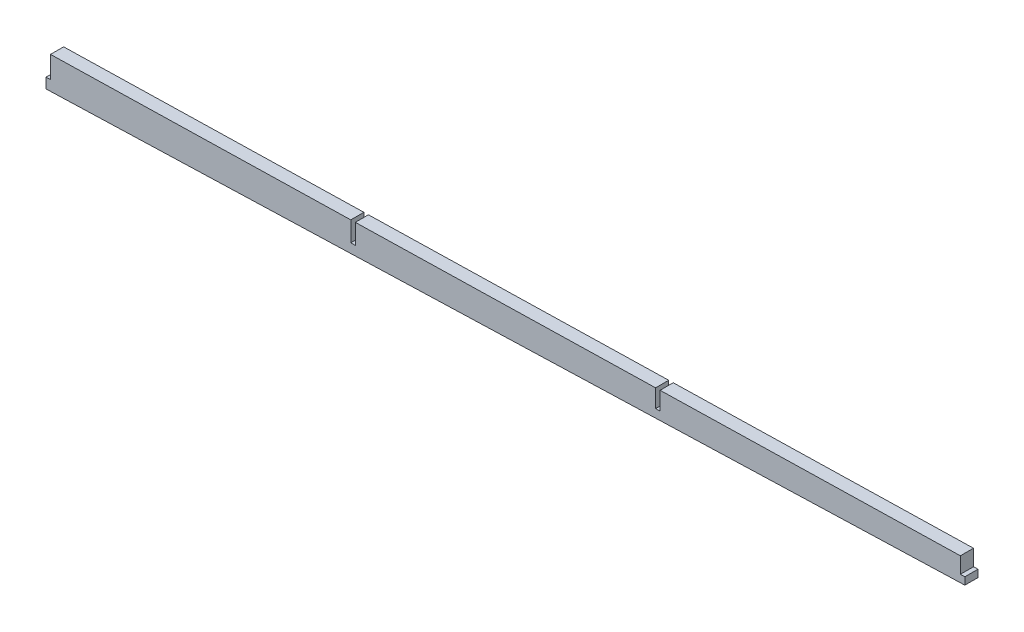
ISO-10303-21;
HEADER;
FILE_DESCRIPTION(('STEP AP214'),'2;1');
FILE_NAME('part.step','',(''),(''),'','','');
FILE_SCHEMA(('AUTOMOTIVE_DESIGN { 1 0 10303 214 1 1 1 1 }'));
ENDSEC;
DATA;
#1=APPLICATION_CONTEXT('core data for automotive mechanical design processes');
#2=APPLICATION_PROTOCOL_DEFINITION('international standard','automotive_design',2000,#1);
#3=PRODUCT_CONTEXT('',#1,'mechanical');
#4=PRODUCT('Part','Part','',(#3));
#5=PRODUCT_RELATED_PRODUCT_CATEGORY('part','',(#4));
#6=PRODUCT_DEFINITION_FORMATION('','',#4);
#7=PRODUCT_DEFINITION_CONTEXT('part definition',#1,'design');
#8=PRODUCT_DEFINITION('design','',#6,#7);
#9=PRODUCT_DEFINITION_SHAPE('','',#8);
#10=(LENGTH_UNIT() NAMED_UNIT(*) SI_UNIT(.MILLI.,.METRE.));
#11=(NAMED_UNIT(*) PLANE_ANGLE_UNIT() SI_UNIT($,.RADIAN.));
#12=(NAMED_UNIT(*) SI_UNIT($,.STERADIAN.) SOLID_ANGLE_UNIT());
#13=UNCERTAINTY_MEASURE_WITH_UNIT(LENGTH_MEASURE(1.E-05),#10,'distance_accuracy_value','');
#14=(GEOMETRIC_REPRESENTATION_CONTEXT(3) GLOBAL_UNCERTAINTY_ASSIGNED_CONTEXT((#13)) GLOBAL_UNIT_ASSIGNED_CONTEXT((#10,
#11,#12)) REPRESENTATION_CONTEXT('',''));
#15=CARTESIAN_POINT('',(0.,0.,0.));
#16=DIRECTION('',(0.,0.,1.));
#17=DIRECTION('',(1.,0.,0.));
#18=AXIS2_PLACEMENT_3D('',#15,#16,#17);
#19=CARTESIAN_POINT('',(1.21390748326506,0.,40.463582775502));
#20=DIRECTION('',(0.029986509105671,0.,0.999550303522367));
#21=DIRECTION('',(0.999550303522367,0.,-0.029986509105671));
#22=AXIS2_PLACEMENT_3D('',#19,#20,#21);
#23=PLANE('',#22);
#24=DIRECTION('',(0.999550303522367,0.,-0.0299865091056743));
#25=VECTOR('',#24,1.);
#26=CARTESIAN_POINT('',(-1000.,0.,70.5));
#27=LINE('',#26,#25);
#28=CARTESIAN_POINT('',(-1000.,0.,70.5));
#29=VERTEX_POINT('',#28);
#30=CARTESIAN_POINT('',(-997.,0.,70.41));
#31=VERTEX_POINT('',#30);
#32=EDGE_CURVE('E187',#29,#31,#27,.T.);
#33=ORIENTED_EDGE('',*,*,#32,.T.);
#34=DIRECTION('',(0.,-1.,0.));
#35=VECTOR('',#34,1.);
#36=CARTESIAN_POINT('',(-997.,30.,70.41));
#37=LINE('',#36,#35);
#38=CARTESIAN_POINT('',(-997.,14.9803921568627,70.41));
#39=VERTEX_POINT('',#38);
#40=EDGE_CURVE('E174',#39,#31,#37,.T.);
#41=ORIENTED_EDGE('',*,*,#40,.F.);
#42=DIRECTION('',(-0.999528973701543,0.00653286910916042,0.0299858692110463));
#43=VECTOR('',#42,1.);
#44=CARTESIAN_POINT('',(-388.,11.,52.14));
#45=LINE('',#44,#43);
#46=CARTESIAN_POINT('',(-797.,13.6732026143791,64.41));
#47=VERTEX_POINT('',#46);
#48=EDGE_CURVE('E348',#47,#39,#45,.T.);
#49=ORIENTED_EDGE('',*,*,#48,.F.);
#50=DIRECTION('',(0.,-1.,0.));
#51=VECTOR('',#50,1.);
#52=CARTESIAN_POINT('',(-797.,30.,64.41));
#53=LINE('',#52,#51);
#54=CARTESIAN_POINT('',(-797.,0.,64.41));
#55=VERTEX_POINT('',#54);
#56=EDGE_CURVE('E428',#47,#55,#53,.T.);
#57=ORIENTED_EDGE('',*,*,#56,.T.);
#58=DIRECTION('',(0.999550303522367,0.,-0.0299865091056743));
#59=VECTOR('',#58,1.);
#60=CARTESIAN_POINT('',(-797.,0.,64.41));
#61=LINE('',#60,#59);
#62=CARTESIAN_POINT('',(-794.,0.,64.32));
#63=VERTEX_POINT('',#62);
#64=EDGE_CURVE('E198',#55,#63,#61,.T.);
#65=ORIENTED_EDGE('',*,*,#64,.T.);
#66=DIRECTION('',(0.,-1.,0.));
#67=VECTOR('',#66,1.);
#68=CARTESIAN_POINT('',(-794.,30.,64.32));
#69=LINE('',#68,#67);
#70=CARTESIAN_POINT('',(-794.,13.6535947712418,64.32));
#71=VERTEX_POINT('',#70);
#72=EDGE_CURVE('E503',#71,#63,#69,.T.);
#73=ORIENTED_EDGE('',*,*,#72,.F.);
#74=CARTESIAN_POINT('',(-594.,12.3464052287582,58.32));
#75=VERTEX_POINT('',#74);
#76=EDGE_CURVE('E365',#75,#71,#45,.T.);
#77=ORIENTED_EDGE('',*,*,#76,.F.);
#78=DIRECTION('',(0.,-1.,0.));
#79=VECTOR('',#78,1.);
#80=CARTESIAN_POINT('',(-594.,30.,58.32));
#81=LINE('',#80,#79);
#82=CARTESIAN_POINT('',(-594.,0.,58.32));
#83=VERTEX_POINT('',#82);
#84=EDGE_CURVE('E416',#75,#83,#81,.T.);
#85=ORIENTED_EDGE('',*,*,#84,.T.);
#86=DIRECTION('',(0.999550303522367,0.,-0.0299865091056674));
#87=VECTOR('',#86,1.);
#88=CARTESIAN_POINT('',(-594.,0.,58.32));
#89=LINE('',#88,#87);
#90=CARTESIAN_POINT('',(-591.,0.,58.23));
#91=VERTEX_POINT('',#90);
#92=EDGE_CURVE('E396',#83,#91,#89,.T.);
#93=ORIENTED_EDGE('',*,*,#92,.T.);
#94=DIRECTION('',(0.,-1.,0.));
#95=VECTOR('',#94,1.);
#96=CARTESIAN_POINT('',(-591.,30.,58.23));
#97=LINE('',#96,#95);
#98=CARTESIAN_POINT('',(-591.,12.3267973856209,58.23));
#99=VERTEX_POINT('',#98);
#100=EDGE_CURVE('E393',#99,#91,#97,.T.);
#101=ORIENTED_EDGE('',*,*,#100,.F.);
#102=CARTESIAN_POINT('',(-391.,11.0196078431373,52.23));
#103=VERTEX_POINT('',#102);
#104=EDGE_CURVE('E309',#103,#99,#45,.T.);
#105=ORIENTED_EDGE('',*,*,#104,.F.);
#106=DIRECTION('',(0.,-1.,0.));
#107=VECTOR('',#106,1.);
#108=CARTESIAN_POINT('',(-391.,30.,52.23));
#109=LINE('',#108,#107);
#110=CARTESIAN_POINT('',(-391.,0.,52.23));
#111=VERTEX_POINT('',#110);
#112=EDGE_CURVE('E391',#103,#111,#109,.T.);
#113=ORIENTED_EDGE('',*,*,#112,.T.);
#114=DIRECTION('',(0.999550303522367,0.,-0.0299865091056727));
#115=VECTOR('',#114,1.);
#116=CARTESIAN_POINT('',(-391.,0.,52.23));
#117=LINE('',#116,#115);
#118=CARTESIAN_POINT('',(-388.,0.,52.14));
#119=VERTEX_POINT('',#118);
#120=EDGE_CURVE('E418',#111,#119,#117,.T.);
#121=ORIENTED_EDGE('',*,*,#120,.T.);
#122=DIRECTION('',(0.,1.,0.));
#123=VECTOR('',#122,1.);
#124=CARTESIAN_POINT('',(-388.,-5.,52.14));
#125=LINE('',#124,#123);
#126=CARTESIAN_POINT('',(-388.,-5.,52.14));
#127=VERTEX_POINT('',#126);
#128=EDGE_CURVE('E206',#127,#119,#125,.T.);
#129=ORIENTED_EDGE('',*,*,#128,.F.);
#130=DIRECTION('',(-0.999544970939143,-0.00326648683313445,0.0299863491281743));
#131=VECTOR('',#130,1.);
#132=CARTESIAN_POINT('',(-388.,-5.,52.14));
#133=LINE('',#132,#131);
#134=CARTESIAN_POINT('',(-1000.,-7.,70.5));
#135=VERTEX_POINT('',#134);
#136=EDGE_CURVE('E313',#127,#135,#133,.T.);
#137=ORIENTED_EDGE('',*,*,#136,.T.);
#138=DIRECTION('',(0.,-1.,0.));
#139=VECTOR('',#138,1.);
#140=CARTESIAN_POINT('',(-1000.,15.,70.5));
#141=LINE('',#140,#139);
#142=EDGE_CURVE('E195',#29,#135,#141,.T.);
#143=ORIENTED_EDGE('',*,*,#142,.F.);
#144=EDGE_LOOP('',(#33,#41,#49,#57,#65,#73,#77,#85,#93,#101,#105,#113,#121,#129,#137,#143));
#145=FACE_BOUND('',#144,.T.);
#146=ADVANCED_FACE('F57',(#145),#23,.F.);
#147=CARTESIAN_POINT('',(1.48366470176841,0.,49.4554900589469));
#148=DIRECTION('',(-0.029986509105671,0.,-0.999550303522367));
#149=DIRECTION('',(-0.999550303522367,0.,0.029986509105671));
#150=AXIS2_PLACEMENT_3D('',#147,#148,#149);
#151=PLANE('',#150);
#152=DIRECTION('',(-0.999528973701543,0.00653286910916042,0.0299858692110463));
#153=VECTOR('',#152,1.);
#154=CARTESIAN_POINT('',(-388.,11.,61.14));
#155=LINE('',#154,#153);
#156=CARTESIAN_POINT('',(-797.,13.6732026143791,73.41));
#157=VERTEX_POINT('',#156);
#158=CARTESIAN_POINT('',(-997.,14.9803921568627,79.41));
#159=VERTEX_POINT('',#158);
#160=EDGE_CURVE('E317',#157,#159,#155,.T.);
#161=ORIENTED_EDGE('',*,*,#160,.T.);
#162=DIRECTION('',(0.,-1.,0.));
#163=VECTOR('',#162,1.);
#164=CARTESIAN_POINT('',(-997.,30.,79.41));
#165=LINE('',#164,#163);
#166=CARTESIAN_POINT('',(-997.,0.,79.41));
#167=VERTEX_POINT('',#166);
#168=EDGE_CURVE('E77',#159,#167,#165,.T.);
#169=ORIENTED_EDGE('',*,*,#168,.T.);
#170=DIRECTION('',(-0.999550303522367,0.,0.0299865091056686));
#171=VECTOR('',#170,1.);
#172=CARTESIAN_POINT('',(-997.,0.,79.41));
#173=LINE('',#172,#171);
#174=CARTESIAN_POINT('',(-1000.,0.,79.5));
#175=VERTEX_POINT('',#174);
#176=EDGE_CURVE('E190',#167,#175,#173,.T.);
#177=ORIENTED_EDGE('',*,*,#176,.T.);
#178=DIRECTION('',(0.,1.,0.));
#179=VECTOR('',#178,1.);
#180=CARTESIAN_POINT('',(-1000.,-7.,79.5));
#181=LINE('',#180,#179);
#182=CARTESIAN_POINT('',(-1000.,-7.,79.5));
#183=VERTEX_POINT('',#182);
#184=EDGE_CURVE('E62',#183,#175,#181,.T.);
#185=ORIENTED_EDGE('',*,*,#184,.F.);
#186=DIRECTION('',(-0.999544970939143,-0.00326648683313446,0.0299863491281743));
#187=VECTOR('',#186,1.);
#188=CARTESIAN_POINT('',(-388.,-5.,61.14));
#189=LINE('',#188,#187);
#190=CARTESIAN_POINT('',(-388.,-5.,61.14));
#191=VERTEX_POINT('',#190);
#192=EDGE_CURVE('E306',#191,#183,#189,.T.);
#193=ORIENTED_EDGE('',*,*,#192,.F.);
#194=DIRECTION('',(0.,-1.,0.));
#195=VECTOR('',#194,1.);
#196=CARTESIAN_POINT('',(-388.,-5.,61.14));
#197=LINE('',#196,#195);
#198=CARTESIAN_POINT('',(-388.,0.,61.14));
#199=VERTEX_POINT('',#198);
#200=EDGE_CURVE('E319',#199,#191,#197,.T.);
#201=ORIENTED_EDGE('',*,*,#200,.F.);
#202=DIRECTION('',(-0.999550303522367,0.,0.0299865091056732));
#203=VECTOR('',#202,1.);
#204=CARTESIAN_POINT('',(-388.,0.,61.14));
#205=LINE('',#204,#203);
#206=CARTESIAN_POINT('',(-391.,0.,61.23));
#207=VERTEX_POINT('',#206);
#208=EDGE_CURVE('E252',#199,#207,#205,.T.);
#209=ORIENTED_EDGE('',*,*,#208,.T.);
#210=DIRECTION('',(0.,-1.,0.));
#211=VECTOR('',#210,1.);
#212=CARTESIAN_POINT('',(-391.,30.,61.23));
#213=LINE('',#212,#211);
#214=CARTESIAN_POINT('',(-391.,11.0196078431373,61.23));
#215=VERTEX_POINT('',#214);
#216=EDGE_CURVE('E429',#215,#207,#213,.T.);
#217=ORIENTED_EDGE('',*,*,#216,.F.);
#218=CARTESIAN_POINT('',(-591.,12.3267973856209,67.23));
#219=VERTEX_POINT('',#218);
#220=EDGE_CURVE('E344',#215,#219,#155,.T.);
#221=ORIENTED_EDGE('',*,*,#220,.T.);
#222=DIRECTION('',(0.,-1.,0.));
#223=VECTOR('',#222,1.);
#224=CARTESIAN_POINT('',(-591.,30.,67.23));
#225=LINE('',#224,#223);
#226=CARTESIAN_POINT('',(-591.,0.,67.23));
#227=VERTEX_POINT('',#226);
#228=EDGE_CURVE('E402',#219,#227,#225,.T.);
#229=ORIENTED_EDGE('',*,*,#228,.T.);
#230=DIRECTION('',(-0.999550303522367,0.,0.0299865091056651));
#231=VECTOR('',#230,1.);
#232=CARTESIAN_POINT('',(-591.,0.,67.23));
#233=LINE('',#232,#231);
#234=CARTESIAN_POINT('',(-594.,0.,67.32));
#235=VERTEX_POINT('',#234);
#236=EDGE_CURVE('E407',#227,#235,#233,.T.);
#237=ORIENTED_EDGE('',*,*,#236,.T.);
#238=DIRECTION('',(0.,-1.,0.));
#239=VECTOR('',#238,1.);
#240=CARTESIAN_POINT('',(-594.,30.,67.32));
#241=LINE('',#240,#239);
#242=CARTESIAN_POINT('',(-594.,12.3464052287582,67.32));
#243=VERTEX_POINT('',#242);
#244=EDGE_CURVE('E410',#243,#235,#241,.T.);
#245=ORIENTED_EDGE('',*,*,#244,.F.);
#246=CARTESIAN_POINT('',(-794.,13.6535947712418,73.32));
#247=VERTEX_POINT('',#246);
#248=EDGE_CURVE('E349',#243,#247,#155,.T.);
#249=ORIENTED_EDGE('',*,*,#248,.T.);
#250=DIRECTION('',(0.,-1.,0.));
#251=VECTOR('',#250,1.);
#252=CARTESIAN_POINT('',(-794.,30.,73.32));
#253=LINE('',#252,#251);
#254=CARTESIAN_POINT('',(-794.,0.,73.32));
#255=VERTEX_POINT('',#254);
#256=EDGE_CURVE('E84',#247,#255,#253,.T.);
#257=ORIENTED_EDGE('',*,*,#256,.T.);
#258=DIRECTION('',(-0.999550303522367,0.,0.0299865091056675));
#259=VECTOR('',#258,1.);
#260=CARTESIAN_POINT('',(-794.,0.,73.32));
#261=LINE('',#260,#259);
#262=CARTESIAN_POINT('',(-797.,0.,73.41));
#263=VERTEX_POINT('',#262);
#264=EDGE_CURVE('E512',#255,#263,#261,.T.);
#265=ORIENTED_EDGE('',*,*,#264,.T.);
#266=DIRECTION('',(0.,-1.,0.));
#267=VECTOR('',#266,1.);
#268=CARTESIAN_POINT('',(-797.,30.,73.41));
#269=LINE('',#268,#267);
#270=EDGE_CURVE('E359',#157,#263,#269,.T.);
#271=ORIENTED_EDGE('',*,*,#270,.F.);
#272=EDGE_LOOP('',(#161,#169,#177,#185,#193,#201,#209,#217,#221,#229,#237,#245,#249,#257,#265,#271));
#273=FACE_BOUND('',#272,.T.);
#274=ADVANCED_FACE('F273',(#273),#151,.F.);
#275=CARTESIAN_POINT('',(0.055318240068347,8.46369073045708,0.));
#276=DIRECTION('',(-0.00653580811358207,-0.999978641378056,0.));
#277=DIRECTION('',(0.999978641378056,-0.00653580811358207,0.));
#278=AXIS2_PLACEMENT_3D('',#275,#276,#277);
#279=PLANE('',#278);
#280=ORIENTED_EDGE('',*,*,#48,.T.);
#281=DIRECTION('',(0.,0.,1.));
#282=VECTOR('',#281,1.);
#283=CARTESIAN_POINT('',(-997.000000000001,14.9803921568628,1.23028991893759E-11));
#284=LINE('',#283,#282);
#285=EDGE_CURVE('E12',#39,#159,#284,.T.);
#286=ORIENTED_EDGE('',*,*,#285,.T.);
#287=ORIENTED_EDGE('',*,*,#160,.F.);
#288=DIRECTION('',(0.,0.,1.));
#289=VECTOR('',#288,1.);
#290=CARTESIAN_POINT('',(-797.,13.6732026143791,0.));
#291=LINE('',#290,#289);
#292=EDGE_CURVE('E69',#47,#157,#291,.T.);
#293=ORIENTED_EDGE('',*,*,#292,.F.);
#294=EDGE_LOOP('',(#280,#286,#287,#293));
#295=FACE_BOUND('',#294,.T.);
#296=ADVANCED_FACE('F362',(#295),#279,.F.);
#297=ORIENTED_EDGE('',*,*,#76,.T.);
#298=DIRECTION('',(0.,0.,1.));
#299=VECTOR('',#298,1.);
#300=CARTESIAN_POINT('',(-794.000000000002,13.6535947712419,1.95941018445177E-11));
#301=LINE('',#300,#299);
#302=EDGE_CURVE('E485',#71,#247,#301,.T.);
#303=ORIENTED_EDGE('',*,*,#302,.T.);
#304=ORIENTED_EDGE('',*,*,#248,.F.);
#305=DIRECTION('',(0.,0.,1.));
#306=VECTOR('',#305,1.);
#307=CARTESIAN_POINT('',(-594.,12.3464052287582,0.));
#308=LINE('',#307,#306);
#309=EDGE_CURVE('E488',#75,#243,#308,.T.);
#310=ORIENTED_EDGE('',*,*,#309,.F.);
#311=EDGE_LOOP('',(#297,#303,#304,#310));
#312=FACE_BOUND('',#311,.T.);
#313=ADVANCED_FACE('F500',(#312),#279,.F.);
#314=ORIENTED_EDGE('',*,*,#104,.T.);
#315=DIRECTION('',(0.,0.,1.));
#316=VECTOR('',#315,1.);
#317=CARTESIAN_POINT('',(-591.,12.3267973856209,0.));
#318=LINE('',#317,#316);
#319=EDGE_CURVE('E387',#99,#219,#318,.T.);
#320=ORIENTED_EDGE('',*,*,#319,.T.);
#321=ORIENTED_EDGE('',*,*,#220,.F.);
#322=DIRECTION('',(0.,0.,1.));
#323=VECTOR('',#322,1.);
#324=CARTESIAN_POINT('',(-391.,11.0196078431373,2.41421935730249E-12));
#325=LINE('',#324,#323);
#326=EDGE_CURVE('E232',#103,#215,#325,.T.);
#327=ORIENTED_EDGE('',*,*,#326,.F.);
#328=EDGE_LOOP('',(#314,#320,#321,#327));
#329=FACE_BOUND('',#328,.T.);
#330=ADVANCED_FACE('F385',(#329),#279,.F.);
#331=CARTESIAN_POINT('',(-1000.,0.,0.));
#332=DIRECTION('',(-1.,0.,0.));
#333=DIRECTION('',(0.,0.,1.));
#334=AXIS2_PLACEMENT_3D('',#331,#332,#333);
#335=PLANE('',#334);
#336=DIRECTION('',(0.,0.,-1.));
#337=VECTOR('',#336,1.);
#338=CARTESIAN_POINT('',(-1000.,0.,79.5));
#339=LINE('',#338,#337);
#340=EDGE_CURVE('E183',#175,#29,#339,.T.);
#341=ORIENTED_EDGE('',*,*,#340,.T.);
#342=ORIENTED_EDGE('',*,*,#142,.T.);
#343=DIRECTION('',(0.,0.,1.));
#344=VECTOR('',#343,1.);
#345=CARTESIAN_POINT('',(-1000.,-7.,70.5));
#346=LINE('',#345,#344);
#347=EDGE_CURVE('E218',#135,#183,#346,.T.);
#348=ORIENTED_EDGE('',*,*,#347,.T.);
#349=ORIENTED_EDGE('',*,*,#184,.T.);
#350=EDGE_LOOP('',(#341,#342,#348,#349));
#351=FACE_BOUND('',#350,.T.);
#352=ADVANCED_FACE('F59',(#351),#335,.T.);
#353=CARTESIAN_POINT('',(-388.,0.,0.));
#354=DIRECTION('',(-1.,0.,0.));
#355=DIRECTION('',(0.,0.,1.));
#356=AXIS2_PLACEMENT_3D('',#353,#354,#355);
#357=PLANE('',#356);
#358=ORIENTED_EDGE('',*,*,#128,.T.);
#359=DIRECTION('',(0.,0.,1.));
#360=VECTOR('',#359,1.);
#361=CARTESIAN_POINT('',(-388.,0.,52.14));
#362=LINE('',#361,#360);
#363=EDGE_CURVE('E441',#119,#199,#362,.T.);
#364=ORIENTED_EDGE('',*,*,#363,.T.);
#365=ORIENTED_EDGE('',*,*,#200,.T.);
#366=DIRECTION('',(0.,0.,-1.));
#367=VECTOR('',#366,1.);
#368=CARTESIAN_POINT('',(-388.,-5.,61.14));
#369=LINE('',#368,#367);
#370=EDGE_CURVE('E310',#191,#127,#369,.T.);
#371=ORIENTED_EDGE('',*,*,#370,.T.);
#372=EDGE_LOOP('',(#358,#364,#365,#371));
#373=FACE_BOUND('',#372,.T.);
#374=ADVANCED_FACE('F461',(#373),#357,.F.);
#375=CARTESIAN_POINT('',(0.012196033619189,-3.73198628747183,0.));
#376=DIRECTION('',(-0.00326795640593532,0.999994660216208,0.));
#377=DIRECTION('',(-0.999994660216208,-0.00326795640593532,0.));
#378=AXIS2_PLACEMENT_3D('',#375,#376,#377);
#379=PLANE('',#378);
#380=ORIENTED_EDGE('',*,*,#192,.T.);
#381=ORIENTED_EDGE('',*,*,#347,.F.);
#382=ORIENTED_EDGE('',*,*,#136,.F.);
#383=ORIENTED_EDGE('',*,*,#370,.F.);
#384=EDGE_LOOP('',(#380,#381,#382,#383));
#385=FACE_BOUND('',#384,.T.);
#386=ADVANCED_FACE('F274',(#385),#379,.F.);
#387=CARTESIAN_POINT('',(-391.,30.,52.23));
#388=DIRECTION('',(1.,0.,0.));
#389=DIRECTION('',(0.,0.,-1.));
#390=AXIS2_PLACEMENT_3D('',#387,#388,#389);
#391=PLANE('',#390);
#392=ORIENTED_EDGE('',*,*,#326,.T.);
#393=ORIENTED_EDGE('',*,*,#216,.T.);
#394=DIRECTION('',(0.,0.,1.));
#395=VECTOR('',#394,1.);
#396=CARTESIAN_POINT('',(-391.,0.,52.23));
#397=LINE('',#396,#395);
#398=EDGE_CURVE('E432',#111,#207,#397,.T.);
#399=ORIENTED_EDGE('',*,*,#398,.F.);
#400=ORIENTED_EDGE('',*,*,#112,.F.);
#401=EDGE_LOOP('',(#392,#393,#399,#400));
#402=FACE_BOUND('',#401,.T.);
#403=ADVANCED_FACE('F494',(#402),#391,.T.);
#404=CARTESIAN_POINT('',(0.,0.,0.));
#405=DIRECTION('',(0.,-1.,0.));
#406=DIRECTION('',(0.,0.,-1.));
#407=AXIS2_PLACEMENT_3D('',#404,#405,#406);
#408=PLANE('',#407);
#409=ORIENTED_EDGE('',*,*,#120,.F.);
#410=ORIENTED_EDGE('',*,*,#398,.T.);
#411=ORIENTED_EDGE('',*,*,#208,.F.);
#412=ORIENTED_EDGE('',*,*,#363,.F.);
#413=EDGE_LOOP('',(#409,#410,#411,#412));
#414=FACE_BOUND('',#413,.T.);
#415=ADVANCED_FACE('F470',(#414),#408,.F.);
#416=CARTESIAN_POINT('',(-594.,30.,58.32));
#417=DIRECTION('',(1.,0.,0.));
#418=DIRECTION('',(0.,0.,-1.));
#419=AXIS2_PLACEMENT_3D('',#416,#417,#418);
#420=PLANE('',#419);
#421=ORIENTED_EDGE('',*,*,#309,.T.);
#422=ORIENTED_EDGE('',*,*,#244,.T.);
#423=DIRECTION('',(0.,0.,1.));
#424=VECTOR('',#423,1.);
#425=CARTESIAN_POINT('',(-594.,0.,58.32));
#426=LINE('',#425,#424);
#427=EDGE_CURVE('E401',#83,#235,#426,.T.);
#428=ORIENTED_EDGE('',*,*,#427,.F.);
#429=ORIENTED_EDGE('',*,*,#84,.F.);
#430=EDGE_LOOP('',(#421,#422,#428,#429));
#431=FACE_BOUND('',#430,.T.);
#432=ADVANCED_FACE('F499',(#431),#420,.T.);
#433=CARTESIAN_POINT('',(-591.,30.,58.23));
#434=DIRECTION('',(1.,0.,0.));
#435=DIRECTION('',(0.,0.,-1.));
#436=AXIS2_PLACEMENT_3D('',#433,#434,#435);
#437=PLANE('',#436);
#438=ORIENTED_EDGE('',*,*,#100,.T.);
#439=DIRECTION('',(0.,0.,1.));
#440=VECTOR('',#439,1.);
#441=CARTESIAN_POINT('',(-591.,0.,58.23));
#442=LINE('',#441,#440);
#443=EDGE_CURVE('E423',#91,#227,#442,.T.);
#444=ORIENTED_EDGE('',*,*,#443,.T.);
#445=ORIENTED_EDGE('',*,*,#228,.F.);
#446=ORIENTED_EDGE('',*,*,#319,.F.);
#447=EDGE_LOOP('',(#438,#444,#445,#446));
#448=FACE_BOUND('',#447,.T.);
#449=ADVANCED_FACE('F495',(#448),#437,.F.);
#450=CARTESIAN_POINT('',(0.,0.,0.));
#451=DIRECTION('',(0.,-1.,0.));
#452=DIRECTION('',(0.,0.,-1.));
#453=AXIS2_PLACEMENT_3D('',#450,#451,#452);
#454=PLANE('',#453);
#455=ORIENTED_EDGE('',*,*,#92,.F.);
#456=ORIENTED_EDGE('',*,*,#427,.T.);
#457=ORIENTED_EDGE('',*,*,#236,.F.);
#458=ORIENTED_EDGE('',*,*,#443,.F.);
#459=EDGE_LOOP('',(#455,#456,#457,#458));
#460=FACE_BOUND('',#459,.T.);
#461=ADVANCED_FACE('F497',(#460),#454,.F.);
#462=CARTESIAN_POINT('',(-797.,30.,64.41));
#463=DIRECTION('',(1.,0.,0.));
#464=DIRECTION('',(0.,0.,-1.));
#465=AXIS2_PLACEMENT_3D('',#462,#463,#464);
#466=PLANE('',#465);
#467=ORIENTED_EDGE('',*,*,#292,.T.);
#468=ORIENTED_EDGE('',*,*,#270,.T.);
#469=DIRECTION('',(0.,0.,1.));
#470=VECTOR('',#469,1.);
#471=CARTESIAN_POINT('',(-797.,0.,64.41));
#472=LINE('',#471,#470);
#473=EDGE_CURVE('E507',#55,#263,#472,.T.);
#474=ORIENTED_EDGE('',*,*,#473,.F.);
#475=ORIENTED_EDGE('',*,*,#56,.F.);
#476=EDGE_LOOP('',(#467,#468,#474,#475));
#477=FACE_BOUND('',#476,.T.);
#478=ADVANCED_FACE('F526',(#477),#466,.T.);
#479=CARTESIAN_POINT('',(-794.,30.,64.32));
#480=DIRECTION('',(1.,0.,0.));
#481=DIRECTION('',(0.,0.,-1.));
#482=AXIS2_PLACEMENT_3D('',#479,#480,#481);
#483=PLANE('',#482);
#484=ORIENTED_EDGE('',*,*,#72,.T.);
#485=DIRECTION('',(0.,0.,1.));
#486=VECTOR('',#485,1.);
#487=CARTESIAN_POINT('',(-794.,0.,64.32));
#488=LINE('',#487,#486);
#489=EDGE_CURVE('E202',#63,#255,#488,.T.);
#490=ORIENTED_EDGE('',*,*,#489,.T.);
#491=ORIENTED_EDGE('',*,*,#256,.F.);
#492=ORIENTED_EDGE('',*,*,#302,.F.);
#493=EDGE_LOOP('',(#484,#490,#491,#492));
#494=FACE_BOUND('',#493,.T.);
#495=ADVANCED_FACE('F502',(#494),#483,.F.);
#496=CARTESIAN_POINT('',(0.,0.,0.));
#497=DIRECTION('',(0.,-1.,0.));
#498=DIRECTION('',(0.,0.,-1.));
#499=AXIS2_PLACEMENT_3D('',#496,#497,#498);
#500=PLANE('',#499);
#501=ORIENTED_EDGE('',*,*,#64,.F.);
#502=ORIENTED_EDGE('',*,*,#473,.T.);
#503=ORIENTED_EDGE('',*,*,#264,.F.);
#504=ORIENTED_EDGE('',*,*,#489,.F.);
#505=EDGE_LOOP('',(#501,#502,#503,#504));
#506=FACE_BOUND('',#505,.T.);
#507=ADVANCED_FACE('F524',(#506),#500,.F.);
#508=CARTESIAN_POINT('',(-997.,30.,70.41));
#509=DIRECTION('',(1.,0.,0.));
#510=DIRECTION('',(0.,0.,-1.));
#511=AXIS2_PLACEMENT_3D('',#508,#509,#510);
#512=PLANE('',#511);
#513=ORIENTED_EDGE('',*,*,#40,.T.);
#514=DIRECTION('',(0.,0.,1.));
#515=VECTOR('',#514,1.);
#516=CARTESIAN_POINT('',(-997.,0.,70.41));
#517=LINE('',#516,#515);
#518=EDGE_CURVE('E177',#31,#167,#517,.T.);
#519=ORIENTED_EDGE('',*,*,#518,.T.);
#520=ORIENTED_EDGE('',*,*,#168,.F.);
#521=ORIENTED_EDGE('',*,*,#285,.F.);
#522=EDGE_LOOP('',(#513,#519,#520,#521));
#523=FACE_BOUND('',#522,.T.);
#524=ADVANCED_FACE('F176',(#523),#512,.F.);
#525=CARTESIAN_POINT('',(0.,0.,0.));
#526=DIRECTION('',(0.,-1.,0.));
#527=DIRECTION('',(0.,0.,-1.));
#528=AXIS2_PLACEMENT_3D('',#525,#526,#527);
#529=PLANE('',#528);
#530=ORIENTED_EDGE('',*,*,#32,.F.);
#531=ORIENTED_EDGE('',*,*,#340,.F.);
#532=ORIENTED_EDGE('',*,*,#176,.F.);
#533=ORIENTED_EDGE('',*,*,#518,.F.);
#534=EDGE_LOOP('',(#530,#531,#532,#533));
#535=FACE_BOUND('',#534,.T.);
#536=ADVANCED_FACE('F186',(#535),#529,.F.);
#537=CLOSED_SHELL('',(#146,#274,#296,#313,#330,#352,#374,#386,#403,#415,#432,#449,#461,#478,
#495,#507,#524,#536));
#538=MANIFOLD_SOLID_BREP('B2',#537);
#539=ADVANCED_BREP_SHAPE_REPRESENTATION('',(#18,#538),#14);
#540=SHAPE_DEFINITION_REPRESENTATION(#9,#539);
ENDSEC;
END-ISO-10303-21;
